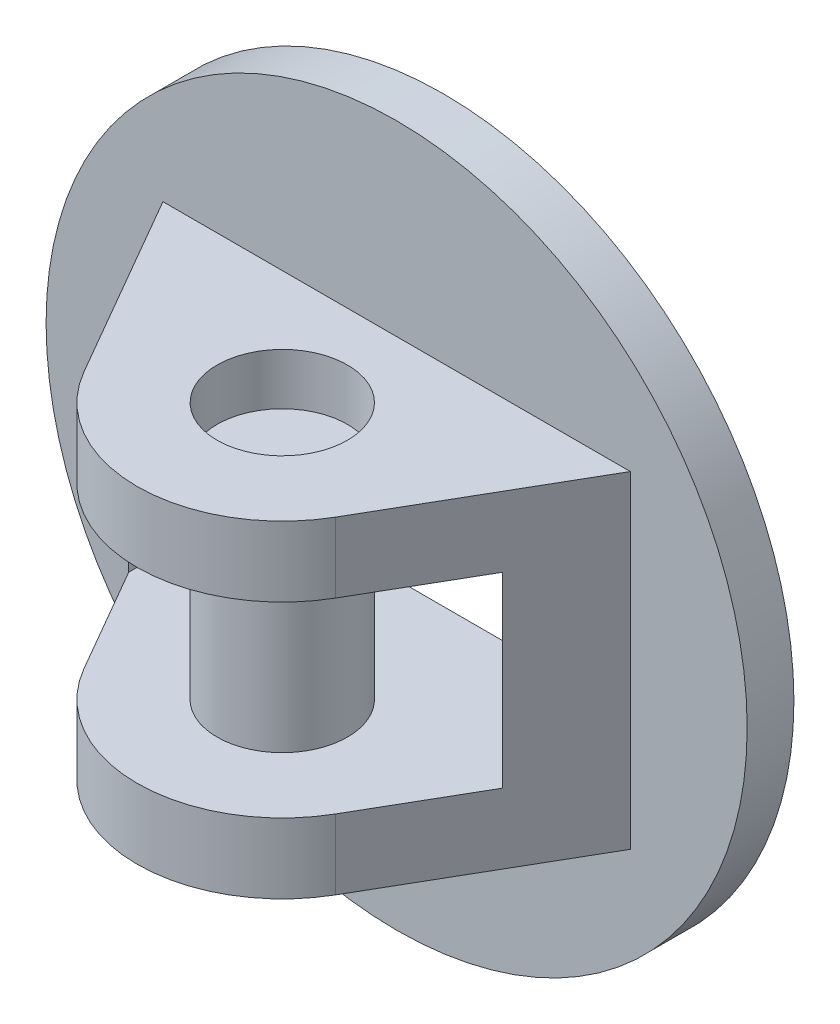
ISO-10303-21;
HEADER;
FILE_DESCRIPTION(('STEP AP214'),'2;1');
FILE_NAME('part.step','',(''),(''),'','','');
FILE_SCHEMA(('AUTOMOTIVE_DESIGN { 1 0 10303 214 1 1 1 1 }'));
ENDSEC;
DATA;
#1=APPLICATION_CONTEXT('core data for automotive mechanical design processes');
#2=APPLICATION_PROTOCOL_DEFINITION('international standard','automotive_design',2000,#1);
#3=PRODUCT_CONTEXT('',#1,'mechanical');
#4=PRODUCT('Part','Part','',(#3));
#5=PRODUCT_RELATED_PRODUCT_CATEGORY('part','',(#4));
#6=PRODUCT_DEFINITION_FORMATION('','',#4);
#7=PRODUCT_DEFINITION_CONTEXT('part definition',#1,'design');
#8=PRODUCT_DEFINITION('design','',#6,#7);
#9=PRODUCT_DEFINITION_SHAPE('','',#8);
#10=(LENGTH_UNIT() NAMED_UNIT(*) SI_UNIT(.MILLI.,.METRE.));
#11=(NAMED_UNIT(*) PLANE_ANGLE_UNIT() SI_UNIT($,.RADIAN.));
#12=(NAMED_UNIT(*) SI_UNIT($,.STERADIAN.) SOLID_ANGLE_UNIT());
#13=UNCERTAINTY_MEASURE_WITH_UNIT(LENGTH_MEASURE(1.E-05),#10,'distance_accuracy_value','');
#14=(GEOMETRIC_REPRESENTATION_CONTEXT(3) GLOBAL_UNCERTAINTY_ASSIGNED_CONTEXT((#13)) GLOBAL_UNIT_ASSIGNED_CONTEXT((#10,
#11,#12)) REPRESENTATION_CONTEXT('',''));
#15=CARTESIAN_POINT('',(0.,0.,0.));
#16=DIRECTION('',(0.,0.,1.));
#17=DIRECTION('',(1.,0.,0.));
#18=AXIS2_PLACEMENT_3D('',#15,#16,#17);
#19=CARTESIAN_POINT('',(1.05818132034585E-13,12.,17.2329099369261));
#20=DIRECTION('',(0.,-1.,0.));
#21=DIRECTION('',(0.,0.,-1.));
#22=AXIS2_PLACEMENT_3D('',#19,#20,#21);
#23=CYLINDRICAL_SURFACE('',#22,6.975);
#24=CARTESIAN_POINT('',(1.05818132034585E-13,12.,17.2329099369261));
#25=DIRECTION('',(0.,1.,0.));
#26=DIRECTION('',(0.,0.,1.));
#27=AXIS2_PLACEMENT_3D('',#24,#25,#26);
#28=CIRCLE('',#27,6.975);
#29=CARTESIAN_POINT('',(1.05818132034585E-13,12.,24.2079099369261));
#30=VERTEX_POINT('',#29);
#31=EDGE_CURVE('E11',#30,#30,#28,.T.);
#32=ORIENTED_EDGE('',*,*,#31,.F.);
#33=EDGE_LOOP('',(#32));
#34=FACE_BOUND('',#33,.T.);
#35=CARTESIAN_POINT('',(1.05818132034585E-13,-12.,17.2329099369261));
#36=DIRECTION('',(0.,1.,0.));
#37=DIRECTION('',(0.,0.,1.));
#38=AXIS2_PLACEMENT_3D('',#35,#36,#37);
#39=CIRCLE('',#38,6.975);
#40=CARTESIAN_POINT('',(1.05818132034585E-13,-12.,24.2079099369261));
#41=VERTEX_POINT('',#40);
#42=EDGE_CURVE('E53',#41,#41,#39,.T.);
#43=ORIENTED_EDGE('',*,*,#42,.T.);
#44=EDGE_LOOP('',(#43));
#45=FACE_BOUND('',#44,.T.);
#46=ADVANCED_FACE('F47',(#34,#45),#23,.T.);
#47=CARTESIAN_POINT('',(1.05818132034585E-13,12.,17.2329099369261));
#48=DIRECTION('',(0.,1.,0.));
#49=DIRECTION('',(0.,0.,1.));
#50=AXIS2_PLACEMENT_3D('',#47,#48,#49);
#51=PLANE('',#50);
#52=ORIENTED_EDGE('',*,*,#31,.T.);
#53=EDGE_LOOP('',(#52));
#54=FACE_BOUND('',#53,.T.);
#55=ADVANCED_FACE('F62',(#54),#51,.T.);
#56=CARTESIAN_POINT('',(1.05818132034585E-13,-12.,17.2329099369261));
#57=DIRECTION('',(0.,1.,0.));
#58=DIRECTION('',(0.,0.,1.));
#59=AXIS2_PLACEMENT_3D('',#56,#57,#58);
#60=PLANE('',#59);
#61=ORIENTED_EDGE('',*,*,#42,.F.);
#62=EDGE_LOOP('',(#61));
#63=FACE_BOUND('',#62,.T.);
#64=ADVANCED_FACE('F60',(#63),#60,.F.);
#65=CLOSED_SHELL('',(#46,#55,#64));
#66=MANIFOLD_SOLID_BREP('B2',#65);
#67=CARTESIAN_POINT('',(1.05818132034585E-13,17.5,17.2329099369261));
#68=DIRECTION('',(0.,-1.,0.));
#69=DIRECTION('',(0.,0.,-1.));
#70=AXIS2_PLACEMENT_3D('',#67,#68,#69);
#71=CYLINDRICAL_SURFACE('',#70,15.5341801261479);
#72=CARTESIAN_POINT('',(1.05818132034585E-13,-10.,17.2329099369261));
#73=DIRECTION('',(0.,-1.,0.));
#74=DIRECTION('',(0.,0.,-1.));
#75=AXIS2_PLACEMENT_3D('',#72,#73,#74);
#76=CIRCLE('',#75,15.5341801261479);
#77=CARTESIAN_POINT('',(13.4529946162076,-10.,25.));
#78=VERTEX_POINT('',#77);
#79=CARTESIAN_POINT('',(-13.4529946162074,-10.,25.));
#80=VERTEX_POINT('',#79);
#81=EDGE_CURVE('E209',#78,#80,#76,.T.);
#82=ORIENTED_EDGE('',*,*,#81,.T.);
#83=DIRECTION('',(0.,-1.,0.));
#84=VECTOR('',#83,1.);
#85=CARTESIAN_POINT('',(-13.4529946162074,17.5,25.));
#86=LINE('',#85,#84);
#87=CARTESIAN_POINT('',(-13.4529946162074,-17.5,25.));
#88=VERTEX_POINT('',#87);
#89=EDGE_CURVE('E260',#80,#88,#86,.T.);
#90=ORIENTED_EDGE('',*,*,#89,.T.);
#91=CARTESIAN_POINT('',(1.05818132034585E-13,-17.5,17.2329099369261));
#92=DIRECTION('',(0.,1.,0.));
#93=DIRECTION('',(0.,0.,-1.));
#94=AXIS2_PLACEMENT_3D('',#91,#92,#93);
#95=CIRCLE('',#94,15.5341801261479);
#96=CARTESIAN_POINT('',(13.4529946162076,-17.5,25.));
#97=VERTEX_POINT('',#96);
#98=EDGE_CURVE('E237',#88,#97,#95,.T.);
#99=ORIENTED_EDGE('',*,*,#98,.T.);
#100=DIRECTION('',(0.,-1.,0.));
#101=VECTOR('',#100,1.);
#102=CARTESIAN_POINT('',(13.4529946162076,17.5,25.));
#103=LINE('',#102,#101);
#104=EDGE_CURVE('E244',#78,#97,#103,.T.);
#105=ORIENTED_EDGE('',*,*,#104,.F.);
#106=EDGE_LOOP('',(#82,#90,#99,#105));
#107=FACE_BOUND('',#106,.T.);
#108=ADVANCED_FACE('F98',(#107),#71,.T.);
#109=CARTESIAN_POINT('',(1.05818132034585E-13,17.5,17.2329099369261));
#110=DIRECTION('',(0.,-1.,0.));
#111=DIRECTION('',(0.,0.,-1.));
#112=AXIS2_PLACEMENT_3D('',#109,#110,#111);
#113=CYLINDRICAL_SURFACE('',#112,6.97551566605455);
#114=CARTESIAN_POINT('',(1.05818132034585E-13,9.99999999999999,17.2329099369261));
#115=DIRECTION('',(0.,1.,0.));
#116=DIRECTION('',(0.,0.,1.));
#117=AXIS2_PLACEMENT_3D('',#114,#115,#116);
#118=CIRCLE('',#117,6.97551566605455);
#119=CARTESIAN_POINT('',(1.05818132034585E-13,9.99999999999999,24.2084256029807));
#120=VERTEX_POINT('',#119);
#121=EDGE_CURVE('E216',#120,#120,#118,.T.);
#122=ORIENTED_EDGE('',*,*,#121,.F.);
#123=EDGE_LOOP('',(#122));
#124=FACE_BOUND('',#123,.T.);
#125=CARTESIAN_POINT('',(1.05818132034585E-13,17.5,17.2329099369261));
#126=DIRECTION('',(0.,1.,0.));
#127=DIRECTION('',(0.,0.,1.));
#128=AXIS2_PLACEMENT_3D('',#125,#126,#127);
#129=CIRCLE('',#128,6.97551566605455);
#130=CARTESIAN_POINT('',(1.05818132034585E-13,17.5,24.2084256029807));
#131=VERTEX_POINT('',#130);
#132=EDGE_CURVE('E227',#131,#131,#129,.T.);
#133=ORIENTED_EDGE('',*,*,#132,.T.);
#134=EDGE_LOOP('',(#133));
#135=FACE_BOUND('',#134,.T.);
#136=ADVANCED_FACE('F321',(#124,#135),#113,.F.);
#137=CARTESIAN_POINT('',(0.,0.,5.00000000000002));
#138=DIRECTION('',(0.,0.,1.));
#139=DIRECTION('',(1.,0.,0.));
#140=AXIS2_PLACEMENT_3D('',#137,#138,#139);
#141=PLANE('',#140);
#142=CARTESIAN_POINT('',(0.,0.,5.00000000000002));
#143=DIRECTION('',(0.,0.,1.));
#144=DIRECTION('',(1.,0.,0.));
#145=AXIS2_PLACEMENT_3D('',#142,#143,#144);
#146=CIRCLE('',#145,37.5);
#147=CARTESIAN_POINT('',(37.5,0.,5.00000000000002));
#148=VERTEX_POINT('',#147);
#149=EDGE_CURVE('E273',#148,#148,#146,.T.);
#150=ORIENTED_EDGE('',*,*,#149,.T.);
#151=EDGE_LOOP('',(#150));
#152=FACE_BOUND('',#151,.T.);
#153=DIRECTION('',(-1.,0.,0.));
#154=VECTOR('',#153,1.);
#155=CARTESIAN_POINT('',(25.,17.5,5.00000000000002));
#156=LINE('',#155,#154);
#157=CARTESIAN_POINT('',(25.,17.5,5.00000000000002));
#158=VERTEX_POINT('',#157);
#159=CARTESIAN_POINT('',(-25.,17.5,5.00000000000002));
#160=VERTEX_POINT('',#159);
#161=EDGE_CURVE('E236',#158,#160,#156,.T.);
#162=ORIENTED_EDGE('',*,*,#161,.F.);
#163=DIRECTION('',(0.,-1.,0.));
#164=VECTOR('',#163,1.);
#165=CARTESIAN_POINT('',(25.,17.5,5.00000000000002));
#166=LINE('',#165,#164);
#167=CARTESIAN_POINT('',(25.,-17.5,5.00000000000002));
#168=VERTEX_POINT('',#167);
#169=EDGE_CURVE('E268',#158,#168,#166,.T.);
#170=ORIENTED_EDGE('',*,*,#169,.T.);
#171=DIRECTION('',(-1.,0.,0.));
#172=VECTOR('',#171,1.);
#173=CARTESIAN_POINT('',(25.,-17.5,5.00000000000002));
#174=LINE('',#173,#172);
#175=CARTESIAN_POINT('',(-25.,-17.5,5.00000000000002));
#176=VERTEX_POINT('',#175);
#177=EDGE_CURVE('E247',#168,#176,#174,.T.);
#178=ORIENTED_EDGE('',*,*,#177,.T.);
#179=DIRECTION('',(0.,-1.,0.));
#180=VECTOR('',#179,1.);
#181=CARTESIAN_POINT('',(-25.,17.5,5.00000000000002));
#182=LINE('',#181,#180);
#183=EDGE_CURVE('E265',#160,#176,#182,.T.);
#184=ORIENTED_EDGE('',*,*,#183,.F.);
#185=EDGE_LOOP('',(#162,#170,#178,#184));
#186=FACE_BOUND('',#185,.T.);
#187=ADVANCED_FACE('F299',(#152,#186),#141,.T.);
#188=CARTESIAN_POINT('',(0.,0.,5.00000000000002));
#189=DIRECTION('',(0.,0.,-1.));
#190=DIRECTION('',(-1.,0.,0.));
#191=AXIS2_PLACEMENT_3D('',#188,#189,#190);
#192=CYLINDRICAL_SURFACE('',#191,37.5);
#193=ORIENTED_EDGE('',*,*,#149,.F.);
#194=EDGE_LOOP('',(#193));
#195=FACE_BOUND('',#194,.T.);
#196=CARTESIAN_POINT('',(0.,0.,0.));
#197=DIRECTION('',(0.,0.,1.));
#198=DIRECTION('',(1.,0.,0.));
#199=AXIS2_PLACEMENT_3D('',#196,#197,#198);
#200=CIRCLE('',#199,37.5);
#201=CARTESIAN_POINT('',(37.5,0.,0.));
#202=VERTEX_POINT('',#201);
#203=EDGE_CURVE('E272',#202,#202,#200,.T.);
#204=ORIENTED_EDGE('',*,*,#203,.T.);
#205=EDGE_LOOP('',(#204));
#206=FACE_BOUND('',#205,.T.);
#207=ADVANCED_FACE('F100',(#195,#206),#192,.T.);
#208=CARTESIAN_POINT('',(0.,0.,0.));
#209=DIRECTION('',(0.,0.,1.));
#210=DIRECTION('',(1.,0.,0.));
#211=AXIS2_PLACEMENT_3D('',#208,#209,#210);
#212=PLANE('',#211);
#213=DIRECTION('',(-1.,0.,0.));
#214=VECTOR('',#213,1.);
#215=CARTESIAN_POINT('',(-20.,9.99999999999999,0.));
#216=LINE('',#215,#214);
#217=CARTESIAN_POINT('',(20.,9.99999999999999,0.));
#218=VERTEX_POINT('',#217);
#219=CARTESIAN_POINT('',(-20.,9.99999999999999,0.));
#220=VERTEX_POINT('',#219);
#221=EDGE_CURVE('E188',#218,#220,#216,.T.);
#222=ORIENTED_EDGE('',*,*,#221,.T.);
#223=DIRECTION('',(0.,-1.,0.));
#224=VECTOR('',#223,1.);
#225=CARTESIAN_POINT('',(-20.,9.99999999999999,0.));
#226=LINE('',#225,#224);
#227=CARTESIAN_POINT('',(-20.,-10.,0.));
#228=VERTEX_POINT('',#227);
#229=EDGE_CURVE('E181',#220,#228,#226,.T.);
#230=ORIENTED_EDGE('',*,*,#229,.T.);
#231=DIRECTION('',(1.,0.,0.));
#232=VECTOR('',#231,1.);
#233=CARTESIAN_POINT('',(-20.,-10.,0.));
#234=LINE('',#233,#232);
#235=CARTESIAN_POINT('',(20.,-10.,0.));
#236=VERTEX_POINT('',#235);
#237=EDGE_CURVE('E191',#228,#236,#234,.T.);
#238=ORIENTED_EDGE('',*,*,#237,.T.);
#239=DIRECTION('',(0.,1.,0.));
#240=VECTOR('',#239,1.);
#241=CARTESIAN_POINT('',(20.,9.99999999999999,0.));
#242=LINE('',#241,#240);
#243=EDGE_CURVE('E113',#236,#218,#242,.T.);
#244=ORIENTED_EDGE('',*,*,#243,.T.);
#245=EDGE_LOOP('',(#222,#230,#238,#244));
#246=FACE_BOUND('',#245,.T.);
#247=ORIENTED_EDGE('',*,*,#203,.F.);
#248=EDGE_LOOP('',(#247));
#249=FACE_BOUND('',#248,.T.);
#250=ADVANCED_FACE('F195',(#246,#249),#212,.F.);
#251=CARTESIAN_POINT('',(1.05818132034585E-13,17.5,17.2329099369261));
#252=DIRECTION('',(0.,-1.,0.));
#253=DIRECTION('',(0.,0.,-1.));
#254=AXIS2_PLACEMENT_3D('',#251,#252,#253);
#255=PLANE('',#254);
#256=DIRECTION('',(0.499999999999998,0.,-0.86602540378444));
#257=VECTOR('',#256,1.);
#258=CARTESIAN_POINT('',(25.,17.5,5.00000000000002));
#259=LINE('',#258,#257);
#260=CARTESIAN_POINT('',(13.4529946162076,17.5,25.));
#261=VERTEX_POINT('',#260);
#262=EDGE_CURVE('E234',#261,#158,#259,.T.);
#263=ORIENTED_EDGE('',*,*,#262,.T.);
#264=ORIENTED_EDGE('',*,*,#161,.T.);
#265=DIRECTION('',(0.500000000000004,0.,0.866025403784436));
#266=VECTOR('',#265,1.);
#267=CARTESIAN_POINT('',(-25.,17.5,5.00000000000002));
#268=LINE('',#267,#266);
#269=CARTESIAN_POINT('',(-13.4529946162074,17.5,25.));
#270=VERTEX_POINT('',#269);
#271=EDGE_CURVE('E121',#160,#270,#268,.T.);
#272=ORIENTED_EDGE('',*,*,#271,.T.);
#273=CARTESIAN_POINT('',(1.05818132034585E-13,17.5,17.2329099369261));
#274=DIRECTION('',(0.,1.,0.));
#275=DIRECTION('',(0.,0.,-1.));
#276=AXIS2_PLACEMENT_3D('',#273,#274,#275);
#277=CIRCLE('',#276,15.5341801261479);
#278=EDGE_CURVE('E241',#270,#261,#277,.T.);
#279=ORIENTED_EDGE('',*,*,#278,.T.);
#280=EDGE_LOOP('',(#263,#264,#272,#279));
#281=FACE_BOUND('',#280,.T.);
#282=ORIENTED_EDGE('',*,*,#132,.F.);
#283=EDGE_LOOP('',(#282));
#284=FACE_BOUND('',#283,.T.);
#285=ADVANCED_FACE('F302',(#281,#284),#255,.F.);
#286=CARTESIAN_POINT('',(1.05818132034585E-13,-17.5,17.2329099369261));
#287=DIRECTION('',(0.,-1.,0.));
#288=DIRECTION('',(0.,0.,-1.));
#289=AXIS2_PLACEMENT_3D('',#286,#287,#288);
#290=PLANE('',#289);
#291=DIRECTION('',(0.499999999999998,0.,-0.86602540378444));
#292=VECTOR('',#291,1.);
#293=CARTESIAN_POINT('',(25.,-17.5,5.00000000000002));
#294=LINE('',#293,#292);
#295=EDGE_CURVE('E231',#97,#168,#294,.T.);
#296=ORIENTED_EDGE('',*,*,#295,.F.);
#297=ORIENTED_EDGE('',*,*,#98,.F.);
#298=DIRECTION('',(0.500000000000004,0.,0.866025403784436));
#299=VECTOR('',#298,1.);
#300=CARTESIAN_POINT('',(-25.,-17.5,5.00000000000002));
#301=LINE('',#300,#299);
#302=EDGE_CURVE('E250',#176,#88,#301,.T.);
#303=ORIENTED_EDGE('',*,*,#302,.F.);
#304=ORIENTED_EDGE('',*,*,#177,.F.);
#305=EDGE_LOOP('',(#296,#297,#303,#304));
#306=FACE_BOUND('',#305,.T.);
#307=CARTESIAN_POINT('',(1.05818132034585E-13,-17.5,17.2329099369261));
#308=DIRECTION('',(0.,1.,0.));
#309=DIRECTION('',(0.,0.,1.));
#310=AXIS2_PLACEMENT_3D('',#307,#308,#309);
#311=CIRCLE('',#310,6.97551566605455);
#312=CARTESIAN_POINT('',(1.05818132034585E-13,-17.5,24.2084256029807));
#313=VERTEX_POINT('',#312);
#314=EDGE_CURVE('E226',#313,#313,#311,.T.);
#315=ORIENTED_EDGE('',*,*,#314,.T.);
#316=EDGE_LOOP('',(#315));
#317=FACE_BOUND('',#316,.T.);
#318=ADVANCED_FACE('F293',(#306,#317),#290,.T.);
#319=CARTESIAN_POINT('',(25.,17.5,5.00000000000002));
#320=DIRECTION('',(-0.86602540378444,0.,-0.499999999999998));
#321=DIRECTION('',(-0.499999999999998,0.,0.86602540378444));
#322=AXIS2_PLACEMENT_3D('',#319,#320,#321);
#323=PLANE('',#322);
#324=CARTESIAN_POINT('',(13.4529946162076,9.99999999999999,25.));
#325=VERTEX_POINT('',#324);
#326=EDGE_CURVE('E256',#261,#325,#103,.T.);
#327=ORIENTED_EDGE('',*,*,#326,.T.);
#328=DIRECTION('',(0.499999999999998,0.,-0.86602540378444));
#329=VECTOR('',#328,1.);
#330=CARTESIAN_POINT('',(25.,9.99999999999999,5.00000000000002));
#331=LINE('',#330,#329);
#332=CARTESIAN_POINT('',(20.,9.99999999999999,13.6602540378445));
#333=VERTEX_POINT('',#332);
#334=EDGE_CURVE('E223',#325,#333,#331,.T.);
#335=ORIENTED_EDGE('',*,*,#334,.T.);
#336=DIRECTION('',(0.,-1.,0.));
#337=VECTOR('',#336,1.);
#338=CARTESIAN_POINT('',(20.,17.5,13.6602540378445));
#339=LINE('',#338,#337);
#340=CARTESIAN_POINT('',(20.,-10.,13.6602540378445));
#341=VERTEX_POINT('',#340);
#342=EDGE_CURVE('E45',#333,#341,#339,.T.);
#343=ORIENTED_EDGE('',*,*,#342,.T.);
#344=DIRECTION('',(-0.499999999999998,0.,0.86602540378444));
#345=VECTOR('',#344,1.);
#346=CARTESIAN_POINT('',(25.,-10.,5.00000000000002));
#347=LINE('',#346,#345);
#348=EDGE_CURVE('E213',#341,#78,#347,.T.);
#349=ORIENTED_EDGE('',*,*,#348,.T.);
#350=ORIENTED_EDGE('',*,*,#104,.T.);
#351=ORIENTED_EDGE('',*,*,#295,.T.);
#352=ORIENTED_EDGE('',*,*,#169,.F.);
#353=ORIENTED_EDGE('',*,*,#262,.F.);
#354=EDGE_LOOP('',(#327,#335,#343,#349,#350,#351,#352,#353));
#355=FACE_BOUND('',#354,.T.);
#356=ADVANCED_FACE('F288',(#355),#323,.F.);
#357=CARTESIAN_POINT('',(-25.,17.5,5.00000000000002));
#358=DIRECTION('',(0.866025403784436,0.,-0.500000000000004));
#359=DIRECTION('',(-0.500000000000004,0.,-0.866025403784436));
#360=AXIS2_PLACEMENT_3D('',#357,#358,#359);
#361=PLANE('',#360);
#362=DIRECTION('',(0.,1.,0.));
#363=VECTOR('',#362,1.);
#364=CARTESIAN_POINT('',(-20.,17.5,13.6602540378443));
#365=LINE('',#364,#363);
#366=CARTESIAN_POINT('',(-20.,-10.,13.6602540378443));
#367=VERTEX_POINT('',#366);
#368=CARTESIAN_POINT('',(-20.,9.99999999999999,13.6602540378443));
#369=VERTEX_POINT('',#368);
#370=EDGE_CURVE('E106',#367,#369,#365,.T.);
#371=ORIENTED_EDGE('',*,*,#370,.T.);
#372=DIRECTION('',(0.500000000000004,0.,0.866025403784436));
#373=VECTOR('',#372,1.);
#374=CARTESIAN_POINT('',(-25.,9.99999999999999,5.00000000000002));
#375=LINE('',#374,#373);
#376=CARTESIAN_POINT('',(-13.4529946162074,9.99999999999999,25.));
#377=VERTEX_POINT('',#376);
#378=EDGE_CURVE('E220',#369,#377,#375,.T.);
#379=ORIENTED_EDGE('',*,*,#378,.T.);
#380=EDGE_CURVE('E261',#270,#377,#86,.T.);
#381=ORIENTED_EDGE('',*,*,#380,.F.);
#382=ORIENTED_EDGE('',*,*,#271,.F.);
#383=ORIENTED_EDGE('',*,*,#183,.T.);
#384=ORIENTED_EDGE('',*,*,#302,.T.);
#385=ORIENTED_EDGE('',*,*,#89,.F.);
#386=DIRECTION('',(-0.500000000000004,0.,-0.866025403784436));
#387=VECTOR('',#386,1.);
#388=CARTESIAN_POINT('',(-25.,-10.,5.00000000000002));
#389=LINE('',#388,#387);
#390=EDGE_CURVE('E211',#80,#367,#389,.T.);
#391=ORIENTED_EDGE('',*,*,#390,.T.);
#392=EDGE_LOOP('',(#371,#379,#381,#382,#383,#384,#385,#391));
#393=FACE_BOUND('',#392,.T.);
#394=ADVANCED_FACE('F283',(#393),#361,.F.);
#395=ORIENTED_EDGE('',*,*,#380,.T.);
#396=CARTESIAN_POINT('',(1.05818132034585E-13,9.99999999999999,17.2329099369261));
#397=DIRECTION('',(0.,1.,0.));
#398=DIRECTION('',(0.,0.,1.));
#399=AXIS2_PLACEMENT_3D('',#396,#397,#398);
#400=CIRCLE('',#399,15.5341801261479);
#401=EDGE_CURVE('E217',#377,#325,#400,.T.);
#402=ORIENTED_EDGE('',*,*,#401,.T.);
#403=ORIENTED_EDGE('',*,*,#326,.F.);
#404=ORIENTED_EDGE('',*,*,#278,.F.);
#405=EDGE_LOOP('',(#395,#402,#403,#404));
#406=FACE_BOUND('',#405,.T.);
#407=ADVANCED_FACE('F307',(#406),#71,.T.);
#408=CARTESIAN_POINT('',(1.05818132034585E-13,-10.,17.2329099369261));
#409=DIRECTION('',(0.,-1.,0.));
#410=DIRECTION('',(0.,0.,-1.));
#411=AXIS2_PLACEMENT_3D('',#408,#409,#410);
#412=CIRCLE('',#411,6.97551566605455);
#413=CARTESIAN_POINT('',(1.05818132034585E-13,-10.,10.2573942708716));
#414=VERTEX_POINT('',#413);
#415=EDGE_CURVE('E204',#414,#414,#412,.T.);
#416=ORIENTED_EDGE('',*,*,#415,.F.);
#417=EDGE_LOOP('',(#416));
#418=FACE_BOUND('',#417,.T.);
#419=ORIENTED_EDGE('',*,*,#314,.F.);
#420=EDGE_LOOP('',(#419));
#421=FACE_BOUND('',#420,.T.);
#422=ADVANCED_FACE('F312',(#418,#421),#113,.F.);
#423=CARTESIAN_POINT('',(20.,9.99999999999999,0.));
#424=DIRECTION('',(1.,0.,0.));
#425=DIRECTION('',(0.,0.,-1.));
#426=AXIS2_PLACEMENT_3D('',#423,#424,#425);
#427=PLANE('',#426);
#428=DIRECTION('',(0.,0.,1.));
#429=VECTOR('',#428,1.);
#430=CARTESIAN_POINT('',(20.,9.99999999999999,0.));
#431=LINE('',#430,#429);
#432=EDGE_CURVE('E205',#218,#333,#431,.T.);
#433=ORIENTED_EDGE('',*,*,#432,.F.);
#434=ORIENTED_EDGE('',*,*,#243,.F.);
#435=DIRECTION('',(0.,0.,1.));
#436=VECTOR('',#435,1.);
#437=CARTESIAN_POINT('',(20.,-10.,0.));
#438=LINE('',#437,#436);
#439=EDGE_CURVE('E187',#236,#341,#438,.T.);
#440=ORIENTED_EDGE('',*,*,#439,.T.);
#441=ORIENTED_EDGE('',*,*,#342,.F.);
#442=EDGE_LOOP('',(#433,#434,#440,#441));
#443=FACE_BOUND('',#442,.T.);
#444=ADVANCED_FACE('F310',(#443),#427,.F.);
#445=CARTESIAN_POINT('',(-20.,9.99999999999999,0.));
#446=DIRECTION('',(-1.,0.,0.));
#447=DIRECTION('',(0.,-1.,0.));
#448=AXIS2_PLACEMENT_3D('',#445,#446,#447);
#449=PLANE('',#448);
#450=DIRECTION('',(0.,0.,1.));
#451=VECTOR('',#450,1.);
#452=CARTESIAN_POINT('',(-20.,-10.,0.));
#453=LINE('',#452,#451);
#454=EDGE_CURVE('E176',#228,#367,#453,.T.);
#455=ORIENTED_EDGE('',*,*,#454,.F.);
#456=ORIENTED_EDGE('',*,*,#229,.F.);
#457=DIRECTION('',(0.,0.,1.));
#458=VECTOR('',#457,1.);
#459=CARTESIAN_POINT('',(-20.,9.99999999999999,0.));
#460=LINE('',#459,#458);
#461=EDGE_CURVE('E202',#220,#369,#460,.T.);
#462=ORIENTED_EDGE('',*,*,#461,.T.);
#463=ORIENTED_EDGE('',*,*,#370,.F.);
#464=EDGE_LOOP('',(#455,#456,#462,#463));
#465=FACE_BOUND('',#464,.T.);
#466=ADVANCED_FACE('F178',(#465),#449,.F.);
#467=CARTESIAN_POINT('',(-20.,9.99999999999999,0.));
#468=DIRECTION('',(0.,1.,0.));
#469=DIRECTION('',(0.,0.,1.));
#470=AXIS2_PLACEMENT_3D('',#467,#468,#469);
#471=PLANE('',#470);
#472=ORIENTED_EDGE('',*,*,#121,.T.);
#473=EDGE_LOOP('',(#472));
#474=FACE_BOUND('',#473,.T.);
#475=ORIENTED_EDGE('',*,*,#401,.F.);
#476=ORIENTED_EDGE('',*,*,#378,.F.);
#477=ORIENTED_EDGE('',*,*,#461,.F.);
#478=ORIENTED_EDGE('',*,*,#221,.F.);
#479=ORIENTED_EDGE('',*,*,#432,.T.);
#480=ORIENTED_EDGE('',*,*,#334,.F.);
#481=EDGE_LOOP('',(#475,#476,#477,#478,#479,#480));
#482=FACE_BOUND('',#481,.T.);
#483=ADVANCED_FACE('F309',(#474,#482),#471,.F.);
#484=CARTESIAN_POINT('',(-20.,-10.,0.));
#485=DIRECTION('',(0.,-1.,0.));
#486=DIRECTION('',(0.,0.,-1.));
#487=AXIS2_PLACEMENT_3D('',#484,#485,#486);
#488=PLANE('',#487);
#489=ORIENTED_EDGE('',*,*,#415,.T.);
#490=EDGE_LOOP('',(#489));
#491=FACE_BOUND('',#490,.T.);
#492=ORIENTED_EDGE('',*,*,#439,.F.);
#493=ORIENTED_EDGE('',*,*,#237,.F.);
#494=ORIENTED_EDGE('',*,*,#454,.T.);
#495=ORIENTED_EDGE('',*,*,#390,.F.);
#496=ORIENTED_EDGE('',*,*,#81,.F.);
#497=ORIENTED_EDGE('',*,*,#348,.F.);
#498=EDGE_LOOP('',(#492,#493,#494,#495,#496,#497));
#499=FACE_BOUND('',#498,.T.);
#500=ADVANCED_FACE('F192',(#491,#499),#488,.F.);
#501=CLOSED_SHELL('',(#108,#136,#187,#207,#250,#285,#318,#356,#394,#407,#422,#444,#466,#483,#500));
#502=MANIFOLD_SOLID_BREP('B6',#501);
#503=ADVANCED_BREP_SHAPE_REPRESENTATION('',(#18,#66,#502),#14);
#504=SHAPE_DEFINITION_REPRESENTATION(#9,#503);
ENDSEC;
END-ISO-10303-21;
